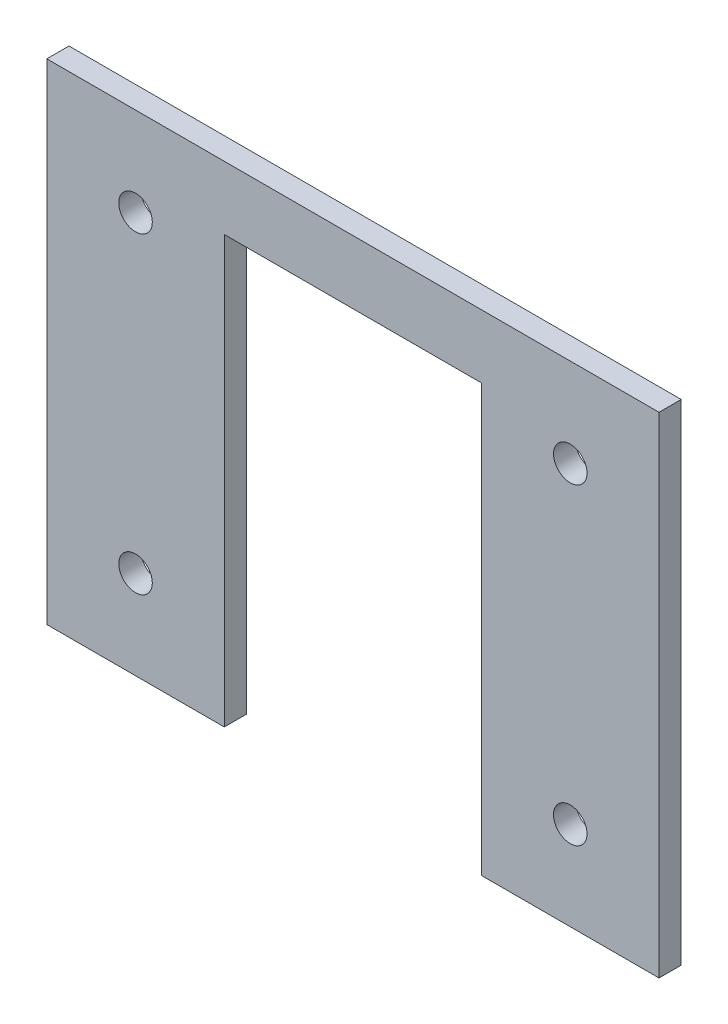
ISO-10303-21;
HEADER;
FILE_DESCRIPTION(('STEP AP214'),'2;1');
FILE_NAME('part.step','',(''),(''),'','','');
FILE_SCHEMA(('AUTOMOTIVE_DESIGN { 1 0 10303 214 1 1 1 1 }'));
ENDSEC;
DATA;
#1=APPLICATION_CONTEXT('core data for automotive mechanical design processes');
#2=APPLICATION_PROTOCOL_DEFINITION('international standard','automotive_design',2000,#1);
#3=PRODUCT_CONTEXT('',#1,'mechanical');
#4=PRODUCT('Part','Part','',(#3));
#5=PRODUCT_RELATED_PRODUCT_CATEGORY('part','',(#4));
#6=PRODUCT_DEFINITION_FORMATION('','',#4);
#7=PRODUCT_DEFINITION_CONTEXT('part definition',#1,'design');
#8=PRODUCT_DEFINITION('design','',#6,#7);
#9=PRODUCT_DEFINITION_SHAPE('','',#8);
#10=(LENGTH_UNIT() NAMED_UNIT(*) SI_UNIT(.MILLI.,.METRE.));
#11=(NAMED_UNIT(*) PLANE_ANGLE_UNIT() SI_UNIT($,.RADIAN.));
#12=(NAMED_UNIT(*) SI_UNIT($,.STERADIAN.) SOLID_ANGLE_UNIT());
#13=UNCERTAINTY_MEASURE_WITH_UNIT(LENGTH_MEASURE(1.E-05),#10,'distance_accuracy_value','');
#14=(GEOMETRIC_REPRESENTATION_CONTEXT(3) GLOBAL_UNCERTAINTY_ASSIGNED_CONTEXT((#13)) GLOBAL_UNIT_ASSIGNED_CONTEXT((#10,
#11,#12)) REPRESENTATION_CONTEXT('',''));
#15=CARTESIAN_POINT('',(0.,0.,0.));
#16=DIRECTION('',(0.,0.,1.));
#17=DIRECTION('',(1.,0.,0.));
#18=AXIS2_PLACEMENT_3D('',#15,#16,#17);
#19=CARTESIAN_POINT('',(0.,0.,3.175));
#20=DIRECTION('',(0.,0.,-1.));
#21=DIRECTION('',(-1.,0.,0.));
#22=AXIS2_PLACEMENT_3D('',#19,#20,#21);
#23=PLANE('',#22);
#24=CARTESIAN_POINT('',(24.2035550239249,53.646277309901,3.175));
#25=DIRECTION('',(0.,0.,1.));
#26=DIRECTION('',(1.,0.,0.));
#27=AXIS2_PLACEMENT_3D('',#24,#25,#26);
#28=CIRCLE('',#27,2.39999999999999);
#29=CARTESIAN_POINT('',(26.6035550239248,53.646277309901,3.175));
#30=VERTEX_POINT('',#29);
#31=EDGE_CURVE('E234',#30,#30,#28,.T.);
#32=ORIENTED_EDGE('',*,*,#31,.F.);
#33=EDGE_LOOP('',(#32));
#34=FACE_BOUND('',#33,.T.);
#35=CARTESIAN_POINT('',(24.2035550239249,8.92627730990105,3.175));
#36=DIRECTION('',(0.,0.,1.));
#37=DIRECTION('',(1.,0.,0.));
#38=AXIS2_PLACEMENT_3D('',#35,#36,#37);
#39=CIRCLE('',#38,2.39999999999999);
#40=CARTESIAN_POINT('',(26.6035550239248,8.92627730990105,3.175));
#41=VERTEX_POINT('',#40);
#42=EDGE_CURVE('E226',#41,#41,#39,.T.);
#43=ORIENTED_EDGE('',*,*,#42,.F.);
#44=EDGE_LOOP('',(#43));
#45=FACE_BOUND('',#44,.T.);
#46=CARTESIAN_POINT('',(86.4235535934129,8.92627730990105,3.175));
#47=DIRECTION('',(0.,0.,1.));
#48=DIRECTION('',(1.,0.,0.));
#49=AXIS2_PLACEMENT_3D('',#46,#47,#48);
#50=CIRCLE('',#49,2.39999999999999);
#51=CARTESIAN_POINT('',(88.8235535934128,8.92627730990105,3.175));
#52=VERTEX_POINT('',#51);
#53=EDGE_CURVE('E218',#52,#52,#50,.T.);
#54=ORIENTED_EDGE('',*,*,#53,.F.);
#55=EDGE_LOOP('',(#54));
#56=FACE_BOUND('',#55,.T.);
#57=CARTESIAN_POINT('',(86.4235535934129,53.646277309901,3.175));
#58=DIRECTION('',(0.,0.,1.));
#59=DIRECTION('',(1.,0.,0.));
#60=AXIS2_PLACEMENT_3D('',#57,#58,#59);
#61=CIRCLE('',#60,2.39999999999999);
#62=CARTESIAN_POINT('',(88.8235535934128,53.646277309901,3.175));
#63=VERTEX_POINT('',#62);
#64=EDGE_CURVE('E210',#63,#63,#61,.T.);
#65=ORIENTED_EDGE('',*,*,#64,.F.);
#66=EDGE_LOOP('',(#65));
#67=FACE_BOUND('',#66,.T.);
#68=DIRECTION('',(0.,-1.,0.));
#69=VECTOR('',#68,1.);
#70=CARTESIAN_POINT('',(11.5035550239249,-3.77372269009896,3.175));
#71=LINE('',#70,#69);
#72=CARTESIAN_POINT('',(11.5035550239249,66.346277309901,3.175));
#73=VERTEX_POINT('',#72);
#74=CARTESIAN_POINT('',(11.5035550239249,-3.77372269009896,3.175));
#75=VERTEX_POINT('',#74);
#76=EDGE_CURVE('E165',#73,#75,#71,.T.);
#77=ORIENTED_EDGE('',*,*,#76,.T.);
#78=DIRECTION('',(1.,0.,0.));
#79=VECTOR('',#78,1.);
#80=CARTESIAN_POINT('',(11.5035550239249,-3.77372269009896,3.175));
#81=LINE('',#80,#79);
#82=CARTESIAN_POINT('',(36.9035550239249,-3.77372269009896,3.175));
#83=VERTEX_POINT('',#82);
#84=EDGE_CURVE('E98',#75,#83,#81,.T.);
#85=ORIENTED_EDGE('',*,*,#84,.T.);
#86=DIRECTION('',(0.,1.,0.));
#87=VECTOR('',#86,1.);
#88=CARTESIAN_POINT('',(36.9035550239249,-3.77372269009896,3.175));
#89=LINE('',#88,#87);
#90=CARTESIAN_POINT('',(36.9035550239249,57.2759417223195,3.175));
#91=VERTEX_POINT('',#90);
#92=EDGE_CURVE('E186',#83,#91,#89,.T.);
#93=ORIENTED_EDGE('',*,*,#92,.T.);
#94=DIRECTION('',(1.,0.,0.));
#95=VECTOR('',#94,1.);
#96=CARTESIAN_POINT('',(36.9035550239249,57.2759417223195,3.175));
#97=LINE('',#96,#95);
#98=CARTESIAN_POINT('',(73.7235535934129,57.2759417223195,3.175));
#99=VERTEX_POINT('',#98);
#100=EDGE_CURVE('E197',#91,#99,#97,.T.);
#101=ORIENTED_EDGE('',*,*,#100,.T.);
#102=DIRECTION('',(0.,-1.,0.));
#103=VECTOR('',#102,1.);
#104=CARTESIAN_POINT('',(73.7235535934129,-3.77372269009894,3.175));
#105=LINE('',#104,#103);
#106=CARTESIAN_POINT('',(73.7235535934129,-3.77372269009894,3.175));
#107=VERTEX_POINT('',#106);
#108=EDGE_CURVE('E117',#99,#107,#105,.T.);
#109=ORIENTED_EDGE('',*,*,#108,.T.);
#110=DIRECTION('',(1.,0.,0.));
#111=VECTOR('',#110,1.);
#112=CARTESIAN_POINT('',(99.1235535934129,-3.77372269009894,3.175));
#113=LINE('',#112,#111);
#114=CARTESIAN_POINT('',(99.1235535934129,-3.77372269009894,3.175));
#115=VERTEX_POINT('',#114);
#116=EDGE_CURVE('E111',#107,#115,#113,.T.);
#117=ORIENTED_EDGE('',*,*,#116,.T.);
#118=DIRECTION('',(0.,1.,0.));
#119=VECTOR('',#118,1.);
#120=CARTESIAN_POINT('',(99.1235535934129,-3.77372269009894,3.175));
#121=LINE('',#120,#119);
#122=CARTESIAN_POINT('',(99.1235535934129,66.346277309901,3.175));
#123=VERTEX_POINT('',#122);
#124=EDGE_CURVE('E114',#115,#123,#121,.T.);
#125=ORIENTED_EDGE('',*,*,#124,.T.);
#126=DIRECTION('',(-1.,0.,0.));
#127=VECTOR('',#126,1.);
#128=CARTESIAN_POINT('',(99.1235535934129,66.346277309901,3.175));
#129=LINE('',#128,#127);
#130=EDGE_CURVE('E57',#123,#73,#129,.T.);
#131=ORIENTED_EDGE('',*,*,#130,.T.);
#132=EDGE_LOOP('',(#77,#85,#93,#101,#109,#117,#125,#131));
#133=FACE_BOUND('',#132,.T.);
#134=ADVANCED_FACE('F39',(#34,#45,#56,#67,#133),#23,.F.);
#135=CARTESIAN_POINT('',(0.,0.,0.));
#136=DIRECTION('',(0.,0.,-1.));
#137=DIRECTION('',(-1.,0.,0.));
#138=AXIS2_PLACEMENT_3D('',#135,#136,#137);
#139=PLANE('',#138);
#140=CARTESIAN_POINT('',(24.2035550239249,53.646277309901,0.));
#141=DIRECTION('',(0.,0.,1.));
#142=DIRECTION('',(1.,0.,0.));
#143=AXIS2_PLACEMENT_3D('',#140,#141,#142);
#144=CIRCLE('',#143,2.4);
#145=CARTESIAN_POINT('',(26.6035550239249,53.646277309901,0.));
#146=VERTEX_POINT('',#145);
#147=EDGE_CURVE('E230',#146,#146,#144,.T.);
#148=ORIENTED_EDGE('',*,*,#147,.T.);
#149=EDGE_LOOP('',(#148));
#150=FACE_BOUND('',#149,.T.);
#151=CARTESIAN_POINT('',(24.2035550239249,8.92627730990105,0.));
#152=DIRECTION('',(0.,0.,1.));
#153=DIRECTION('',(1.,0.,0.));
#154=AXIS2_PLACEMENT_3D('',#151,#152,#153);
#155=CIRCLE('',#154,2.4);
#156=CARTESIAN_POINT('',(26.6035550239249,8.92627730990105,0.));
#157=VERTEX_POINT('',#156);
#158=EDGE_CURVE('E222',#157,#157,#155,.T.);
#159=ORIENTED_EDGE('',*,*,#158,.T.);
#160=EDGE_LOOP('',(#159));
#161=FACE_BOUND('',#160,.T.);
#162=CARTESIAN_POINT('',(86.4235535934129,8.92627730990105,0.));
#163=DIRECTION('',(0.,0.,1.));
#164=DIRECTION('',(1.,0.,0.));
#165=AXIS2_PLACEMENT_3D('',#162,#163,#164);
#166=CIRCLE('',#165,2.4);
#167=CARTESIAN_POINT('',(88.8235535934129,8.92627730990105,0.));
#168=VERTEX_POINT('',#167);
#169=EDGE_CURVE('E214',#168,#168,#166,.T.);
#170=ORIENTED_EDGE('',*,*,#169,.T.);
#171=EDGE_LOOP('',(#170));
#172=FACE_BOUND('',#171,.T.);
#173=CARTESIAN_POINT('',(86.4235535934129,53.646277309901,0.));
#174=DIRECTION('',(0.,0.,1.));
#175=DIRECTION('',(1.,0.,0.));
#176=AXIS2_PLACEMENT_3D('',#173,#174,#175);
#177=CIRCLE('',#176,2.4);
#178=CARTESIAN_POINT('',(88.8235535934129,53.646277309901,0.));
#179=VERTEX_POINT('',#178);
#180=EDGE_CURVE('E146',#179,#179,#177,.T.);
#181=ORIENTED_EDGE('',*,*,#180,.T.);
#182=EDGE_LOOP('',(#181));
#183=FACE_BOUND('',#182,.T.);
#184=DIRECTION('',(0.,-1.,0.));
#185=VECTOR('',#184,1.);
#186=CARTESIAN_POINT('',(11.5035550239249,-3.77372269009896,0.));
#187=LINE('',#186,#185);
#188=CARTESIAN_POINT('',(11.5035550239249,66.346277309901,0.));
#189=VERTEX_POINT('',#188);
#190=CARTESIAN_POINT('',(11.5035550239249,-3.77372269009896,0.));
#191=VERTEX_POINT('',#190);
#192=EDGE_CURVE('E141',#189,#191,#187,.T.);
#193=ORIENTED_EDGE('',*,*,#192,.F.);
#194=DIRECTION('',(-1.,0.,0.));
#195=VECTOR('',#194,1.);
#196=CARTESIAN_POINT('',(11.5035550239249,66.346277309901,0.));
#197=LINE('',#196,#195);
#198=CARTESIAN_POINT('',(99.1235535934129,66.346277309901,0.));
#199=VERTEX_POINT('',#198);
#200=EDGE_CURVE('E86',#199,#189,#197,.T.);
#201=ORIENTED_EDGE('',*,*,#200,.F.);
#202=DIRECTION('',(0.,1.,0.));
#203=VECTOR('',#202,1.);
#204=CARTESIAN_POINT('',(99.1235535934129,-3.77372269009894,0.));
#205=LINE('',#204,#203);
#206=CARTESIAN_POINT('',(99.1235535934129,-3.77372269009894,0.));
#207=VERTEX_POINT('',#206);
#208=EDGE_CURVE('E160',#207,#199,#205,.T.);
#209=ORIENTED_EDGE('',*,*,#208,.F.);
#210=DIRECTION('',(1.,0.,0.));
#211=VECTOR('',#210,1.);
#212=CARTESIAN_POINT('',(99.1235535934129,-3.77372269009894,0.));
#213=LINE('',#212,#211);
#214=CARTESIAN_POINT('',(73.7235535934129,-3.77372269009894,0.));
#215=VERTEX_POINT('',#214);
#216=EDGE_CURVE('E127',#215,#207,#213,.T.);
#217=ORIENTED_EDGE('',*,*,#216,.F.);
#218=DIRECTION('',(0.,-1.,0.));
#219=VECTOR('',#218,1.);
#220=CARTESIAN_POINT('',(73.7235535934129,-3.77372269009894,0.));
#221=LINE('',#220,#219);
#222=CARTESIAN_POINT('',(73.7235535934129,57.2759417223195,0.));
#223=VERTEX_POINT('',#222);
#224=EDGE_CURVE('E155',#223,#215,#221,.T.);
#225=ORIENTED_EDGE('',*,*,#224,.F.);
#226=DIRECTION('',(1.,0.,0.));
#227=VECTOR('',#226,1.);
#228=CARTESIAN_POINT('',(36.9035550239249,57.2759417223195,0.));
#229=LINE('',#228,#227);
#230=CARTESIAN_POINT('',(36.9035550239249,57.2759417223195,0.));
#231=VERTEX_POINT('',#230);
#232=EDGE_CURVE('E152',#231,#223,#229,.T.);
#233=ORIENTED_EDGE('',*,*,#232,.F.);
#234=DIRECTION('',(0.,1.,0.));
#235=VECTOR('',#234,1.);
#236=CARTESIAN_POINT('',(36.9035550239249,-3.77372269009896,0.));
#237=LINE('',#236,#235);
#238=CARTESIAN_POINT('',(36.9035550239249,-3.77372269009896,0.));
#239=VERTEX_POINT('',#238);
#240=EDGE_CURVE('E149',#239,#231,#237,.T.);
#241=ORIENTED_EDGE('',*,*,#240,.F.);
#242=DIRECTION('',(1.,0.,0.));
#243=VECTOR('',#242,1.);
#244=CARTESIAN_POINT('',(11.5035550239249,-3.77372269009896,0.));
#245=LINE('',#244,#243);
#246=EDGE_CURVE('E145',#191,#239,#245,.T.);
#247=ORIENTED_EDGE('',*,*,#246,.F.);
#248=EDGE_LOOP('',(#193,#201,#209,#217,#225,#233,#241,#247));
#249=FACE_BOUND('',#248,.T.);
#250=ADVANCED_FACE('F188',(#150,#161,#172,#183,#249),#139,.T.);
#251=CARTESIAN_POINT('',(11.5035550239249,-3.77372269009896,3.175));
#252=DIRECTION('',(1.,0.,0.));
#253=DIRECTION('',(0.,0.,-1.));
#254=AXIS2_PLACEMENT_3D('',#251,#252,#253);
#255=PLANE('',#254);
#256=ORIENTED_EDGE('',*,*,#192,.T.);
#257=DIRECTION('',(0.,0.,-1.));
#258=VECTOR('',#257,1.);
#259=CARTESIAN_POINT('',(11.5035550239249,-3.77372269009896,3.175));
#260=LINE('',#259,#258);
#261=EDGE_CURVE('E11',#75,#191,#260,.T.);
#262=ORIENTED_EDGE('',*,*,#261,.F.);
#263=ORIENTED_EDGE('',*,*,#76,.F.);
#264=DIRECTION('',(0.,0.,-1.));
#265=VECTOR('',#264,1.);
#266=CARTESIAN_POINT('',(11.5035550239249,66.346277309901,3.175));
#267=LINE('',#266,#265);
#268=EDGE_CURVE('E137',#73,#189,#267,.T.);
#269=ORIENTED_EDGE('',*,*,#268,.T.);
#270=EDGE_LOOP('',(#256,#262,#263,#269));
#271=FACE_BOUND('',#270,.T.);
#272=ADVANCED_FACE('F41',(#271),#255,.F.);
#273=CARTESIAN_POINT('',(11.5035550239249,-3.77372269009896,3.175));
#274=DIRECTION('',(0.,1.,0.));
#275=DIRECTION('',(0.,0.,1.));
#276=AXIS2_PLACEMENT_3D('',#273,#274,#275);
#277=PLANE('',#276);
#278=ORIENTED_EDGE('',*,*,#246,.T.);
#279=DIRECTION('',(0.,0.,-1.));
#280=VECTOR('',#279,1.);
#281=CARTESIAN_POINT('',(36.9035550239249,-3.77372269009896,3.175));
#282=LINE('',#281,#280);
#283=EDGE_CURVE('E49',#83,#239,#282,.T.);
#284=ORIENTED_EDGE('',*,*,#283,.F.);
#285=ORIENTED_EDGE('',*,*,#84,.F.);
#286=ORIENTED_EDGE('',*,*,#261,.T.);
#287=EDGE_LOOP('',(#278,#284,#285,#286));
#288=FACE_BOUND('',#287,.T.);
#289=ADVANCED_FACE('F279',(#288),#277,.F.);
#290=CARTESIAN_POINT('',(36.9035550239249,-3.77372269009896,3.175));
#291=DIRECTION('',(-1.,0.,0.));
#292=DIRECTION('',(0.,0.,1.));
#293=AXIS2_PLACEMENT_3D('',#290,#291,#292);
#294=PLANE('',#293);
#295=ORIENTED_EDGE('',*,*,#240,.T.);
#296=DIRECTION('',(0.,0.,-1.));
#297=VECTOR('',#296,1.);
#298=CARTESIAN_POINT('',(36.9035550239249,57.2759417223195,3.175));
#299=LINE('',#298,#297);
#300=EDGE_CURVE('E176',#91,#231,#299,.T.);
#301=ORIENTED_EDGE('',*,*,#300,.F.);
#302=ORIENTED_EDGE('',*,*,#92,.F.);
#303=ORIENTED_EDGE('',*,*,#283,.T.);
#304=EDGE_LOOP('',(#295,#301,#302,#303));
#305=FACE_BOUND('',#304,.T.);
#306=ADVANCED_FACE('F184',(#305),#294,.F.);
#307=CARTESIAN_POINT('',(36.9035550239249,57.2759417223195,3.175));
#308=DIRECTION('',(0.,1.,0.));
#309=DIRECTION('',(0.,0.,1.));
#310=AXIS2_PLACEMENT_3D('',#307,#308,#309);
#311=PLANE('',#310);
#312=ORIENTED_EDGE('',*,*,#232,.T.);
#313=DIRECTION('',(0.,0.,-1.));
#314=VECTOR('',#313,1.);
#315=CARTESIAN_POINT('',(73.7235535934129,57.2759417223195,3.175));
#316=LINE('',#315,#314);
#317=EDGE_CURVE('E172',#99,#223,#316,.T.);
#318=ORIENTED_EDGE('',*,*,#317,.F.);
#319=ORIENTED_EDGE('',*,*,#100,.F.);
#320=ORIENTED_EDGE('',*,*,#300,.T.);
#321=EDGE_LOOP('',(#312,#318,#319,#320));
#322=FACE_BOUND('',#321,.T.);
#323=ADVANCED_FACE('F192',(#322),#311,.F.);
#324=CARTESIAN_POINT('',(73.7235535934129,-3.77372269009894,3.175));
#325=DIRECTION('',(1.,0.,0.));
#326=DIRECTION('',(0.,0.,-1.));
#327=AXIS2_PLACEMENT_3D('',#324,#325,#326);
#328=PLANE('',#327);
#329=ORIENTED_EDGE('',*,*,#224,.T.);
#330=DIRECTION('',(0.,0.,-1.));
#331=VECTOR('',#330,1.);
#332=CARTESIAN_POINT('',(73.7235535934129,-3.77372269009894,3.175));
#333=LINE('',#332,#331);
#334=EDGE_CURVE('E130',#107,#215,#333,.T.);
#335=ORIENTED_EDGE('',*,*,#334,.F.);
#336=ORIENTED_EDGE('',*,*,#108,.F.);
#337=ORIENTED_EDGE('',*,*,#317,.T.);
#338=EDGE_LOOP('',(#329,#335,#336,#337));
#339=FACE_BOUND('',#338,.T.);
#340=ADVANCED_FACE('F195',(#339),#328,.F.);
#341=CARTESIAN_POINT('',(99.1235535934129,-3.77372269009894,3.175));
#342=DIRECTION('',(0.,1.,0.));
#343=DIRECTION('',(0.,0.,1.));
#344=AXIS2_PLACEMENT_3D('',#341,#342,#343);
#345=PLANE('',#344);
#346=ORIENTED_EDGE('',*,*,#216,.T.);
#347=DIRECTION('',(0.,0.,-1.));
#348=VECTOR('',#347,1.);
#349=CARTESIAN_POINT('',(99.1235535934129,-3.77372269009894,3.175));
#350=LINE('',#349,#348);
#351=EDGE_CURVE('E124',#115,#207,#350,.T.);
#352=ORIENTED_EDGE('',*,*,#351,.F.);
#353=ORIENTED_EDGE('',*,*,#116,.F.);
#354=ORIENTED_EDGE('',*,*,#334,.T.);
#355=EDGE_LOOP('',(#346,#352,#353,#354));
#356=FACE_BOUND('',#355,.T.);
#357=ADVANCED_FACE('F125',(#356),#345,.F.);
#358=CARTESIAN_POINT('',(99.1235535934129,-3.77372269009894,3.175));
#359=DIRECTION('',(-1.,0.,0.));
#360=DIRECTION('',(0.,0.,1.));
#361=AXIS2_PLACEMENT_3D('',#358,#359,#360);
#362=PLANE('',#361);
#363=ORIENTED_EDGE('',*,*,#208,.T.);
#364=DIRECTION('',(0.,0.,-1.));
#365=VECTOR('',#364,1.);
#366=CARTESIAN_POINT('',(99.1235535934129,66.346277309901,3.175));
#367=LINE('',#366,#365);
#368=EDGE_CURVE('E131',#123,#199,#367,.T.);
#369=ORIENTED_EDGE('',*,*,#368,.F.);
#370=ORIENTED_EDGE('',*,*,#124,.F.);
#371=ORIENTED_EDGE('',*,*,#351,.T.);
#372=EDGE_LOOP('',(#363,#369,#370,#371));
#373=FACE_BOUND('',#372,.T.);
#374=ADVANCED_FACE('F133',(#373),#362,.F.);
#375=CARTESIAN_POINT('',(11.5035550239249,66.346277309901,3.175));
#376=DIRECTION('',(0.,-1.,0.));
#377=DIRECTION('',(0.,0.,-1.));
#378=AXIS2_PLACEMENT_3D('',#375,#376,#377);
#379=PLANE('',#378);
#380=ORIENTED_EDGE('',*,*,#200,.T.);
#381=ORIENTED_EDGE('',*,*,#268,.F.);
#382=ORIENTED_EDGE('',*,*,#130,.F.);
#383=ORIENTED_EDGE('',*,*,#368,.T.);
#384=EDGE_LOOP('',(#380,#381,#382,#383));
#385=FACE_BOUND('',#384,.T.);
#386=ADVANCED_FACE('F253',(#385),#379,.F.);
#387=CARTESIAN_POINT('',(86.4235535934129,53.646277309901,3.175));
#388=DIRECTION('',(0.,0.,1.));
#389=DIRECTION('',(1.,0.,0.));
#390=AXIS2_PLACEMENT_3D('',#387,#388,#389);
#391=CYLINDRICAL_SURFACE('',#390,2.39999999999999);
#392=ORIENTED_EDGE('',*,*,#180,.F.);
#393=EDGE_LOOP('',(#392));
#394=FACE_BOUND('',#393,.T.);
#395=ORIENTED_EDGE('',*,*,#64,.T.);
#396=EDGE_LOOP('',(#395));
#397=FACE_BOUND('',#396,.T.);
#398=ADVANCED_FACE('F250',(#394,#397),#391,.F.);
#399=CARTESIAN_POINT('',(86.4235535934129,8.92627730990105,3.175));
#400=DIRECTION('',(0.,0.,1.));
#401=DIRECTION('',(1.,0.,0.));
#402=AXIS2_PLACEMENT_3D('',#399,#400,#401);
#403=CYLINDRICAL_SURFACE('',#402,2.39999999999999);
#404=ORIENTED_EDGE('',*,*,#169,.F.);
#405=EDGE_LOOP('',(#404));
#406=FACE_BOUND('',#405,.T.);
#407=ORIENTED_EDGE('',*,*,#53,.T.);
#408=EDGE_LOOP('',(#407));
#409=FACE_BOUND('',#408,.T.);
#410=ADVANCED_FACE('F252',(#406,#409),#403,.F.);
#411=CARTESIAN_POINT('',(24.2035550239249,8.92627730990105,3.175));
#412=DIRECTION('',(0.,0.,1.));
#413=DIRECTION('',(1.,0.,0.));
#414=AXIS2_PLACEMENT_3D('',#411,#412,#413);
#415=CYLINDRICAL_SURFACE('',#414,2.39999999999999);
#416=ORIENTED_EDGE('',*,*,#158,.F.);
#417=EDGE_LOOP('',(#416));
#418=FACE_BOUND('',#417,.T.);
#419=ORIENTED_EDGE('',*,*,#42,.T.);
#420=EDGE_LOOP('',(#419));
#421=FACE_BOUND('',#420,.T.);
#422=ADVANCED_FACE('F260',(#418,#421),#415,.F.);
#423=CARTESIAN_POINT('',(24.2035550239249,53.646277309901,3.175));
#424=DIRECTION('',(0.,0.,1.));
#425=DIRECTION('',(1.,0.,0.));
#426=AXIS2_PLACEMENT_3D('',#423,#424,#425);
#427=CYLINDRICAL_SURFACE('',#426,2.39999999999999);
#428=ORIENTED_EDGE('',*,*,#147,.F.);
#429=EDGE_LOOP('',(#428));
#430=FACE_BOUND('',#429,.T.);
#431=ORIENTED_EDGE('',*,*,#31,.T.);
#432=EDGE_LOOP('',(#431));
#433=FACE_BOUND('',#432,.T.);
#434=ADVANCED_FACE('F239',(#430,#433),#427,.F.);
#435=CLOSED_SHELL('',(#134,#250,#272,#289,#306,#323,#340,#357,#374,#386,#398,#410,#422,#434));
#436=MANIFOLD_SOLID_BREP('B2',#435);
#437=ADVANCED_BREP_SHAPE_REPRESENTATION('',(#18,#436),#14);
#438=SHAPE_DEFINITION_REPRESENTATION(#9,#437);
ENDSEC;
END-ISO-10303-21;
